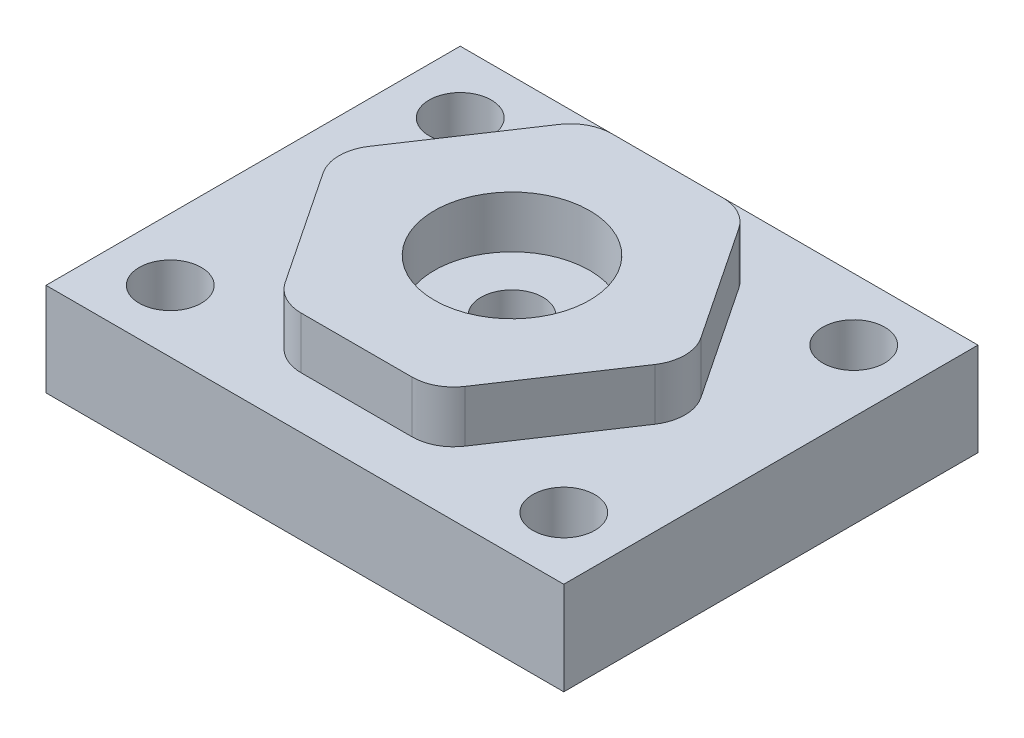
ISO-10303-21;
HEADER;
FILE_DESCRIPTION(('STEP AP214'),'2;1');
FILE_NAME('part.step','',(''),(''),'','','');
FILE_SCHEMA(('AUTOMOTIVE_DESIGN { 1 0 10303 214 1 1 1 1 }'));
ENDSEC;
DATA;
#1=APPLICATION_CONTEXT('core data for automotive mechanical design processes');
#2=APPLICATION_PROTOCOL_DEFINITION('international standard','automotive_design',2000,#1);
#3=PRODUCT_CONTEXT('',#1,'mechanical');
#4=PRODUCT('Part','Part','',(#3));
#5=PRODUCT_RELATED_PRODUCT_CATEGORY('part','',(#4));
#6=PRODUCT_DEFINITION_FORMATION('','',#4);
#7=PRODUCT_DEFINITION_CONTEXT('part definition',#1,'design');
#8=PRODUCT_DEFINITION('design','',#6,#7);
#9=PRODUCT_DEFINITION_SHAPE('','',#8);
#10=(LENGTH_UNIT() NAMED_UNIT(*) SI_UNIT(.MILLI.,.METRE.));
#11=(NAMED_UNIT(*) PLANE_ANGLE_UNIT() SI_UNIT($,.RADIAN.));
#12=(NAMED_UNIT(*) SI_UNIT($,.STERADIAN.) SOLID_ANGLE_UNIT());
#13=UNCERTAINTY_MEASURE_WITH_UNIT(LENGTH_MEASURE(1.E-05),#10,'distance_accuracy_value','');
#14=(GEOMETRIC_REPRESENTATION_CONTEXT(3) GLOBAL_UNCERTAINTY_ASSIGNED_CONTEXT((#13)) GLOBAL_UNIT_ASSIGNED_CONTEXT((#10,
#11,#12)) REPRESENTATION_CONTEXT('',''));
#15=CARTESIAN_POINT('',(0.,0.,0.));
#16=DIRECTION('',(0.,0.,1.));
#17=DIRECTION('',(1.,0.,0.));
#18=AXIS2_PLACEMENT_3D('',#15,#16,#17);
#19=CARTESIAN_POINT('',(13.5,14.,15.));
#20=DIRECTION('',(0.,0.,1.));
#21=DIRECTION('',(1.,0.,0.));
#22=AXIS2_PLACEMENT_3D('',#19,#20,#21);
#23=PLANE('',#22);
#24=DIRECTION('',(-1.,0.,0.));
#25=VECTOR('',#24,1.);
#26=CARTESIAN_POINT('',(13.5,9.,15.));
#27=LINE('',#26,#25);
#28=CARTESIAN_POINT('',(5.35926496604799,9.,15.));
#29=VERTEX_POINT('',#28);
#30=CARTESIAN_POINT('',(-5.35926496604798,9.,15.));
#31=VERTEX_POINT('',#30);
#32=EDGE_CURVE('E181',#29,#31,#27,.T.);
#33=ORIENTED_EDGE('',*,*,#32,.F.);
#34=DIRECTION('',(0.,1.,0.));
#35=VECTOR('',#34,1.);
#36=CARTESIAN_POINT('',(5.35926496604799,9.,15.));
#37=LINE('',#36,#35);
#38=CARTESIAN_POINT('',(5.35926496604799,14.,15.));
#39=VERTEX_POINT('',#38);
#40=EDGE_CURVE('E292',#29,#39,#37,.T.);
#41=ORIENTED_EDGE('',*,*,#40,.T.);
#42=DIRECTION('',(-1.,0.,0.));
#43=VECTOR('',#42,1.);
#44=CARTESIAN_POINT('',(13.5,14.,15.));
#45=LINE('',#44,#43);
#46=CARTESIAN_POINT('',(-5.35926496604798,14.,15.));
#47=VERTEX_POINT('',#46);
#48=EDGE_CURVE('E45',#39,#47,#45,.T.);
#49=ORIENTED_EDGE('',*,*,#48,.T.);
#50=DIRECTION('',(0.,1.,0.));
#51=VECTOR('',#50,1.);
#52=CARTESIAN_POINT('',(-5.35926496604798,9.,15.));
#53=LINE('',#52,#51);
#54=EDGE_CURVE('E294',#31,#47,#53,.T.);
#55=ORIENTED_EDGE('',*,*,#54,.F.);
#56=EDGE_LOOP('',(#33,#41,#49,#55));
#57=FACE_BOUND('',#56,.T.);
#58=ADVANCED_FACE('F30',(#57),#23,.T.);
#59=CARTESIAN_POINT('',(-13.5,14.,11.));
#60=DIRECTION('',(0.,-1.,0.));
#61=DIRECTION('',(0.,0.,-1.));
#62=AXIS2_PLACEMENT_3D('',#59,#60,#61);
#63=PLANE('',#62);
#64=CARTESIAN_POINT('',(0.,14.,0.));
#65=DIRECTION('',(0.,1.,0.));
#66=DIRECTION('',(0.,0.,1.));
#67=AXIS2_PLACEMENT_3D('',#64,#65,#66);
#68=CIRCLE('',#67,7.5);
#69=CARTESIAN_POINT('',(0.,14.,7.5));
#70=VERTEX_POINT('',#69);
#71=EDGE_CURVE('E186',#70,#70,#68,.T.);
#72=ORIENTED_EDGE('',*,*,#71,.F.);
#73=EDGE_LOOP('',(#72));
#74=FACE_BOUND('',#73,.T.);
#75=CARTESIAN_POINT('',(5.35926496604801,14.,11.));
#76=DIRECTION('',(0.,1.,0.));
#77=DIRECTION('',(0.,0.,1.));
#78=AXIS2_PLACEMENT_3D('',#75,#76,#77);
#79=CIRCLE('',#78,4.);
#80=CARTESIAN_POINT('',(8.6874661433994,14.,13.2188007849009));
#81=VERTEX_POINT('',#80);
#82=EDGE_CURVE('E165',#39,#81,#79,.T.);
#83=ORIENTED_EDGE('',*,*,#82,.T.);
#84=DIRECTION('',(0.554700196225229,0.,-0.832050294337844));
#85=VECTOR('',#84,1.);
#86=CARTESIAN_POINT('',(1.03937397389173,14.,24.6909390391624));
#87=LINE('',#86,#85);
#88=CARTESIAN_POINT('',(16.0207994767327,14.,2.21880078490094));
#89=VERTEX_POINT('',#88);
#90=EDGE_CURVE('E348',#81,#89,#87,.T.);
#91=ORIENTED_EDGE('',*,*,#90,.T.);
#92=CARTESIAN_POINT('',(12.6925982993814,14.,0.));
#93=DIRECTION('',(0.,1.,0.));
#94=DIRECTION('',(0.,0.,1.));
#95=AXIS2_PLACEMENT_3D('',#92,#93,#94);
#96=CIRCLE('',#95,4.);
#97=CARTESIAN_POINT('',(16.0207994767327,14.,-2.21880078490093));
#98=VERTEX_POINT('',#97);
#99=EDGE_CURVE('E351',#89,#98,#96,.T.);
#100=ORIENTED_EDGE('',*,*,#99,.T.);
#101=DIRECTION('',(0.554700196225229,0.,0.832050294337844));
#102=VECTOR('',#101,1.);
#103=CARTESIAN_POINT('',(1.03937397389173,14.,-24.6909390391624));
#104=LINE('',#103,#102);
#105=CARTESIAN_POINT('',(8.68746614339941,14.,-13.2188007849009));
#106=VERTEX_POINT('',#105);
#107=EDGE_CURVE('E354',#106,#98,#104,.T.);
#108=ORIENTED_EDGE('',*,*,#107,.F.);
#109=CARTESIAN_POINT('',(5.35926496604801,14.,-11.));
#110=DIRECTION('',(0.,1.,0.));
#111=DIRECTION('',(0.,0.,1.));
#112=AXIS2_PLACEMENT_3D('',#109,#110,#111);
#113=CIRCLE('',#112,4.);
#114=CARTESIAN_POINT('',(5.35926496604799,14.,-15.));
#115=VERTEX_POINT('',#114);
#116=EDGE_CURVE('E286',#115,#106,#113,.F.);
#117=ORIENTED_EDGE('',*,*,#116,.F.);
#118=DIRECTION('',(-1.,0.,0.));
#119=VECTOR('',#118,1.);
#120=CARTESIAN_POINT('',(13.5,14.,-15.));
#121=LINE('',#120,#119);
#122=CARTESIAN_POINT('',(-5.35926496604799,14.,-15.));
#123=VERTEX_POINT('',#122);
#124=EDGE_CURVE('E173',#115,#123,#121,.T.);
#125=ORIENTED_EDGE('',*,*,#124,.T.);
#126=CARTESIAN_POINT('',(-5.35926496604801,14.,-11.));
#127=DIRECTION('',(0.,1.,0.));
#128=DIRECTION('',(0.,0.,1.));
#129=AXIS2_PLACEMENT_3D('',#126,#127,#128);
#130=CIRCLE('',#129,4.);
#131=CARTESIAN_POINT('',(-8.68746614339939,14.,-13.2188007849009));
#132=VERTEX_POINT('',#131);
#133=EDGE_CURVE('E284',#123,#132,#130,.T.);
#134=ORIENTED_EDGE('',*,*,#133,.T.);
#135=DIRECTION('',(-0.554700196225229,0.,0.832050294337844));
#136=VECTOR('',#135,1.);
#137=CARTESIAN_POINT('',(-23.1913952568775,14.,8.53709288531626));
#138=LINE('',#137,#136);
#139=CARTESIAN_POINT('',(-16.0207994767327,14.,-2.21880078490093));
#140=VERTEX_POINT('',#139);
#141=EDGE_CURVE('E314',#132,#140,#138,.T.);
#142=ORIENTED_EDGE('',*,*,#141,.T.);
#143=CARTESIAN_POINT('',(-12.6925982993813,14.,0.));
#144=DIRECTION('',(0.,1.,0.));
#145=DIRECTION('',(0.,0.,1.));
#146=AXIS2_PLACEMENT_3D('',#143,#144,#145);
#147=CIRCLE('',#146,4.);
#148=CARTESIAN_POINT('',(-16.0207994767327,14.,2.21880078490094));
#149=VERTEX_POINT('',#148);
#150=EDGE_CURVE('E311',#149,#140,#147,.F.);
#151=ORIENTED_EDGE('',*,*,#150,.F.);
#152=DIRECTION('',(-0.554700196225229,0.,-0.832050294337844));
#153=VECTOR('',#152,1.);
#154=CARTESIAN_POINT('',(-23.1913952568775,14.,-8.53709288531625));
#155=LINE('',#154,#153);
#156=CARTESIAN_POINT('',(-8.68746614339939,14.,13.2188007849009));
#157=VERTEX_POINT('',#156);
#158=EDGE_CURVE('E308',#157,#149,#155,.T.);
#159=ORIENTED_EDGE('',*,*,#158,.F.);
#160=CARTESIAN_POINT('',(-5.359264966048,14.,11.));
#161=DIRECTION('',(0.,1.,0.));
#162=DIRECTION('',(0.,0.,1.));
#163=AXIS2_PLACEMENT_3D('',#160,#161,#162);
#164=CIRCLE('',#163,4.);
#165=EDGE_CURVE('E291',#47,#157,#164,.F.);
#166=ORIENTED_EDGE('',*,*,#165,.F.);
#167=ORIENTED_EDGE('',*,*,#48,.F.);
#168=EDGE_LOOP('',(#83,#91,#100,#108,#117,#125,#134,#142,#151,#159,#166,#167));
#169=FACE_BOUND('',#168,.T.);
#170=ADVANCED_FACE('F233',(#74,#169),#63,.F.);
#171=CARTESIAN_POINT('',(-25.,9.,20.));
#172=DIRECTION('',(1.,0.,0.));
#173=DIRECTION('',(0.,0.,-1.));
#174=AXIS2_PLACEMENT_3D('',#171,#172,#173);
#175=PLANE('',#174);
#176=DIRECTION('',(0.,0.,1.));
#177=VECTOR('',#176,1.);
#178=CARTESIAN_POINT('',(-25.,0.,20.));
#179=LINE('',#178,#177);
#180=CARTESIAN_POINT('',(-25.,0.,-20.));
#181=VERTEX_POINT('',#180);
#182=CARTESIAN_POINT('',(-25.,0.,20.));
#183=VERTEX_POINT('',#182);
#184=EDGE_CURVE('E198',#181,#183,#179,.T.);
#185=ORIENTED_EDGE('',*,*,#184,.T.);
#186=DIRECTION('',(0.,-1.,0.));
#187=VECTOR('',#186,1.);
#188=CARTESIAN_POINT('',(-25.,9.,20.));
#189=LINE('',#188,#187);
#190=CARTESIAN_POINT('',(-25.,9.,20.));
#191=VERTEX_POINT('',#190);
#192=EDGE_CURVE('E11',#191,#183,#189,.T.);
#193=ORIENTED_EDGE('',*,*,#192,.F.);
#194=DIRECTION('',(0.,0.,1.));
#195=VECTOR('',#194,1.);
#196=CARTESIAN_POINT('',(-25.,9.,20.));
#197=LINE('',#196,#195);
#198=CARTESIAN_POINT('',(-25.,9.,-20.));
#199=VERTEX_POINT('',#198);
#200=EDGE_CURVE('E191',#199,#191,#197,.T.);
#201=ORIENTED_EDGE('',*,*,#200,.F.);
#202=DIRECTION('',(0.,-1.,0.));
#203=VECTOR('',#202,1.);
#204=CARTESIAN_POINT('',(-25.,9.,-20.));
#205=LINE('',#204,#203);
#206=EDGE_CURVE('E197',#199,#181,#205,.T.);
#207=ORIENTED_EDGE('',*,*,#206,.T.);
#208=EDGE_LOOP('',(#185,#193,#201,#207));
#209=FACE_BOUND('',#208,.T.);
#210=ADVANCED_FACE('F32',(#209),#175,.F.);
#211=CARTESIAN_POINT('',(25.,9.,20.));
#212=DIRECTION('',(0.,0.,-1.));
#213=DIRECTION('',(-1.,0.,0.));
#214=AXIS2_PLACEMENT_3D('',#211,#212,#213);
#215=PLANE('',#214);
#216=DIRECTION('',(1.,0.,0.));
#217=VECTOR('',#216,1.);
#218=CARTESIAN_POINT('',(25.,0.,20.));
#219=LINE('',#218,#217);
#220=CARTESIAN_POINT('',(25.,0.,20.));
#221=VERTEX_POINT('',#220);
#222=EDGE_CURVE('E201',#183,#221,#219,.T.);
#223=ORIENTED_EDGE('',*,*,#222,.T.);
#224=DIRECTION('',(0.,-1.,0.));
#225=VECTOR('',#224,1.);
#226=CARTESIAN_POINT('',(25.,9.,20.));
#227=LINE('',#226,#225);
#228=CARTESIAN_POINT('',(25.,9.,20.));
#229=VERTEX_POINT('',#228);
#230=EDGE_CURVE('E38',#229,#221,#227,.T.);
#231=ORIENTED_EDGE('',*,*,#230,.F.);
#232=DIRECTION('',(1.,0.,0.));
#233=VECTOR('',#232,1.);
#234=CARTESIAN_POINT('',(25.,9.,20.));
#235=LINE('',#234,#233);
#236=EDGE_CURVE('E82',#191,#229,#235,.T.);
#237=ORIENTED_EDGE('',*,*,#236,.F.);
#238=ORIENTED_EDGE('',*,*,#192,.T.);
#239=EDGE_LOOP('',(#223,#231,#237,#238));
#240=FACE_BOUND('',#239,.T.);
#241=ADVANCED_FACE('F229',(#240),#215,.F.);
#242=CARTESIAN_POINT('',(25.,9.,20.));
#243=DIRECTION('',(-1.,0.,0.));
#244=DIRECTION('',(0.,0.,1.));
#245=AXIS2_PLACEMENT_3D('',#242,#243,#244);
#246=PLANE('',#245);
#247=DIRECTION('',(0.,0.,-1.));
#248=VECTOR('',#247,1.);
#249=CARTESIAN_POINT('',(25.,0.,20.));
#250=LINE('',#249,#248);
#251=CARTESIAN_POINT('',(25.,0.,-20.));
#252=VERTEX_POINT('',#251);
#253=EDGE_CURVE('E203',#221,#252,#250,.T.);
#254=ORIENTED_EDGE('',*,*,#253,.T.);
#255=DIRECTION('',(0.,-1.,0.));
#256=VECTOR('',#255,1.);
#257=CARTESIAN_POINT('',(25.,9.,-20.));
#258=LINE('',#257,#256);
#259=CARTESIAN_POINT('',(25.,9.,-20.));
#260=VERTEX_POINT('',#259);
#261=EDGE_CURVE('E207',#260,#252,#258,.T.);
#262=ORIENTED_EDGE('',*,*,#261,.F.);
#263=DIRECTION('',(0.,0.,-1.));
#264=VECTOR('',#263,1.);
#265=CARTESIAN_POINT('',(25.,9.,20.));
#266=LINE('',#265,#264);
#267=EDGE_CURVE('E194',#229,#260,#266,.T.);
#268=ORIENTED_EDGE('',*,*,#267,.F.);
#269=ORIENTED_EDGE('',*,*,#230,.T.);
#270=EDGE_LOOP('',(#254,#262,#268,#269));
#271=FACE_BOUND('',#270,.T.);
#272=ADVANCED_FACE('F212',(#271),#246,.F.);
#273=CARTESIAN_POINT('',(25.,9.,-20.));
#274=DIRECTION('',(0.,0.,1.));
#275=DIRECTION('',(1.,0.,0.));
#276=AXIS2_PLACEMENT_3D('',#273,#274,#275);
#277=PLANE('',#276);
#278=DIRECTION('',(-1.,0.,0.));
#279=VECTOR('',#278,1.);
#280=CARTESIAN_POINT('',(25.,0.,-20.));
#281=LINE('',#280,#279);
#282=EDGE_CURVE('E75',#252,#181,#281,.T.);
#283=ORIENTED_EDGE('',*,*,#282,.T.);
#284=ORIENTED_EDGE('',*,*,#206,.F.);
#285=DIRECTION('',(-1.,0.,0.));
#286=VECTOR('',#285,1.);
#287=CARTESIAN_POINT('',(25.,9.,-20.));
#288=LINE('',#287,#286);
#289=EDGE_CURVE('E54',#260,#199,#288,.T.);
#290=ORIENTED_EDGE('',*,*,#289,.F.);
#291=ORIENTED_EDGE('',*,*,#261,.T.);
#292=EDGE_LOOP('',(#283,#284,#290,#291));
#293=FACE_BOUND('',#292,.T.);
#294=ADVANCED_FACE('F220',(#293),#277,.F.);
#295=CARTESIAN_POINT('',(-25.,9.,-20.));
#296=DIRECTION('',(0.,1.,0.));
#297=DIRECTION('',(0.,0.,1.));
#298=AXIS2_PLACEMENT_3D('',#295,#296,#297);
#299=PLANE('',#298);
#300=CARTESIAN_POINT('',(19.,9.,-14.));
#301=DIRECTION('',(0.,1.,0.));
#302=DIRECTION('',(0.,0.,-1.));
#303=AXIS2_PLACEMENT_3D('',#300,#301,#302);
#304=CIRCLE('',#303,3.);
#305=CARTESIAN_POINT('',(19.,9.,-17.));
#306=VERTEX_POINT('',#305);
#307=EDGE_CURVE('E376',#306,#306,#304,.T.);
#308=ORIENTED_EDGE('',*,*,#307,.F.);
#309=EDGE_LOOP('',(#308));
#310=FACE_BOUND('',#309,.T.);
#311=CARTESIAN_POINT('',(19.,9.,14.));
#312=DIRECTION('',(0.,1.,0.));
#313=DIRECTION('',(0.,0.,1.));
#314=AXIS2_PLACEMENT_3D('',#311,#312,#313);
#315=CIRCLE('',#314,3.);
#316=CARTESIAN_POINT('',(19.,9.,17.));
#317=VERTEX_POINT('',#316);
#318=EDGE_CURVE('E372',#317,#317,#315,.T.);
#319=ORIENTED_EDGE('',*,*,#318,.F.);
#320=EDGE_LOOP('',(#319));
#321=FACE_BOUND('',#320,.T.);
#322=CARTESIAN_POINT('',(-19.,9.,14.));
#323=DIRECTION('',(0.,1.,0.));
#324=DIRECTION('',(0.,0.,-1.));
#325=AXIS2_PLACEMENT_3D('',#322,#323,#324);
#326=CIRCLE('',#325,3.);
#327=CARTESIAN_POINT('',(-19.,9.,11.));
#328=VERTEX_POINT('',#327);
#329=EDGE_CURVE('E368',#328,#328,#326,.T.);
#330=ORIENTED_EDGE('',*,*,#329,.F.);
#331=EDGE_LOOP('',(#330));
#332=FACE_BOUND('',#331,.T.);
#333=CARTESIAN_POINT('',(-19.,9.,-14.));
#334=DIRECTION('',(0.,1.,0.));
#335=DIRECTION('',(0.,0.,1.));
#336=AXIS2_PLACEMENT_3D('',#333,#334,#335);
#337=CIRCLE('',#336,3.);
#338=CARTESIAN_POINT('',(-19.,9.,-11.));
#339=VERTEX_POINT('',#338);
#340=EDGE_CURVE('E364',#339,#339,#337,.T.);
#341=ORIENTED_EDGE('',*,*,#340,.F.);
#342=EDGE_LOOP('',(#341));
#343=FACE_BOUND('',#342,.T.);
#344=CARTESIAN_POINT('',(5.35926496604801,9.,11.));
#345=DIRECTION('',(0.,1.,0.));
#346=DIRECTION('',(0.,0.,1.));
#347=AXIS2_PLACEMENT_3D('',#344,#345,#346);
#348=CIRCLE('',#347,4.);
#349=CARTESIAN_POINT('',(8.6874661433994,9.,13.2188007849009));
#350=VERTEX_POINT('',#349);
#351=EDGE_CURVE('E174',#29,#350,#348,.T.);
#352=ORIENTED_EDGE('',*,*,#351,.F.);
#353=ORIENTED_EDGE('',*,*,#32,.T.);
#354=CARTESIAN_POINT('',(-5.359264966048,9.,11.));
#355=DIRECTION('',(0.,1.,0.));
#356=DIRECTION('',(0.,0.,1.));
#357=AXIS2_PLACEMENT_3D('',#354,#355,#356);
#358=CIRCLE('',#357,4.);
#359=CARTESIAN_POINT('',(-8.68746614339939,9.,13.2188007849009));
#360=VERTEX_POINT('',#359);
#361=EDGE_CURVE('E335',#31,#360,#358,.F.);
#362=ORIENTED_EDGE('',*,*,#361,.T.);
#363=DIRECTION('',(-0.554700196225229,0.,-0.832050294337844));
#364=VECTOR('',#363,1.);
#365=CARTESIAN_POINT('',(-23.1913952568775,9.,-8.53709288531625));
#366=LINE('',#365,#364);
#367=CARTESIAN_POINT('',(-16.0207994767327,9.,2.21880078490094));
#368=VERTEX_POINT('',#367);
#369=EDGE_CURVE('E302',#360,#368,#366,.T.);
#370=ORIENTED_EDGE('',*,*,#369,.T.);
#371=CARTESIAN_POINT('',(-12.6925982993813,9.,0.));
#372=DIRECTION('',(0.,1.,0.));
#373=DIRECTION('',(0.,0.,1.));
#374=AXIS2_PLACEMENT_3D('',#371,#372,#373);
#375=CIRCLE('',#374,4.);
#376=CARTESIAN_POINT('',(-16.0207994767327,9.,-2.21880078490093));
#377=VERTEX_POINT('',#376);
#378=EDGE_CURVE('E297',#368,#377,#375,.F.);
#379=ORIENTED_EDGE('',*,*,#378,.T.);
#380=DIRECTION('',(-0.554700196225229,0.,0.832050294337844));
#381=VECTOR('',#380,1.);
#382=CARTESIAN_POINT('',(-23.1913952568775,9.,8.53709288531626));
#383=LINE('',#382,#381);
#384=CARTESIAN_POINT('',(-8.68746614339939,9.,-13.2188007849009));
#385=VERTEX_POINT('',#384);
#386=EDGE_CURVE('E295',#385,#377,#383,.T.);
#387=ORIENTED_EDGE('',*,*,#386,.F.);
#388=CARTESIAN_POINT('',(-5.35926496604801,9.,-11.));
#389=DIRECTION('',(0.,1.,0.));
#390=DIRECTION('',(0.,0.,1.));
#391=AXIS2_PLACEMENT_3D('',#388,#389,#390);
#392=CIRCLE('',#391,4.);
#393=CARTESIAN_POINT('',(-5.35926496604799,9.,-15.));
#394=VERTEX_POINT('',#393);
#395=EDGE_CURVE('E180',#394,#385,#392,.T.);
#396=ORIENTED_EDGE('',*,*,#395,.F.);
#397=DIRECTION('',(-1.,0.,0.));
#398=VECTOR('',#397,1.);
#399=CARTESIAN_POINT('',(13.5,9.,-15.));
#400=LINE('',#399,#398);
#401=CARTESIAN_POINT('',(5.35926496604799,9.,-15.));
#402=VERTEX_POINT('',#401);
#403=EDGE_CURVE('E171',#402,#394,#400,.T.);
#404=ORIENTED_EDGE('',*,*,#403,.F.);
#405=CARTESIAN_POINT('',(5.35926496604801,9.,-11.));
#406=DIRECTION('',(0.,1.,0.));
#407=DIRECTION('',(0.,0.,1.));
#408=AXIS2_PLACEMENT_3D('',#405,#406,#407);
#409=CIRCLE('',#408,4.);
#410=CARTESIAN_POINT('',(8.68746614339941,9.,-13.2188007849009));
#411=VERTEX_POINT('',#410);
#412=EDGE_CURVE('E153',#402,#411,#409,.F.);
#413=ORIENTED_EDGE('',*,*,#412,.T.);
#414=DIRECTION('',(0.554700196225229,0.,0.832050294337844));
#415=VECTOR('',#414,1.);
#416=CARTESIAN_POINT('',(1.03937397389173,9.,-24.6909390391624));
#417=LINE('',#416,#415);
#418=CARTESIAN_POINT('',(16.0207994767327,9.,-2.21880078490093));
#419=VERTEX_POINT('',#418);
#420=EDGE_CURVE('E164',#411,#419,#417,.T.);
#421=ORIENTED_EDGE('',*,*,#420,.T.);
#422=CARTESIAN_POINT('',(12.6925982993814,9.,0.));
#423=DIRECTION('',(0.,1.,0.));
#424=DIRECTION('',(0.,0.,1.));
#425=AXIS2_PLACEMENT_3D('',#422,#423,#424);
#426=CIRCLE('',#425,4.);
#427=CARTESIAN_POINT('',(16.0207994767327,9.,2.21880078490094));
#428=VERTEX_POINT('',#427);
#429=EDGE_CURVE('E361',#428,#419,#426,.T.);
#430=ORIENTED_EDGE('',*,*,#429,.F.);
#431=DIRECTION('',(0.554700196225229,0.,-0.832050294337844));
#432=VECTOR('',#431,1.);
#433=CARTESIAN_POINT('',(1.03937397389173,9.,24.6909390391624));
#434=LINE('',#433,#432);
#435=EDGE_CURVE('E359',#350,#428,#434,.T.);
#436=ORIENTED_EDGE('',*,*,#435,.F.);
#437=EDGE_LOOP('',(#352,#353,#362,#370,#379,#387,#396,#404,#413,#421,#430,#436));
#438=FACE_BOUND('',#437,.T.);
#439=ORIENTED_EDGE('',*,*,#200,.T.);
#440=ORIENTED_EDGE('',*,*,#236,.T.);
#441=ORIENTED_EDGE('',*,*,#267,.T.);
#442=ORIENTED_EDGE('',*,*,#289,.T.);
#443=EDGE_LOOP('',(#439,#440,#441,#442));
#444=FACE_BOUND('',#443,.T.);
#445=ADVANCED_FACE('F178',(#310,#321,#332,#343,#438,#444),#299,.T.);
#446=CARTESIAN_POINT('',(-25.,0.,-20.));
#447=DIRECTION('',(0.,1.,0.));
#448=DIRECTION('',(0.,0.,1.));
#449=AXIS2_PLACEMENT_3D('',#446,#447,#448);
#450=PLANE('',#449);
#451=CARTESIAN_POINT('',(19.,0.,-14.));
#452=DIRECTION('',(0.,1.,0.));
#453=DIRECTION('',(0.,0.,-1.));
#454=AXIS2_PLACEMENT_3D('',#451,#452,#453);
#455=CIRCLE('',#454,3.);
#456=CARTESIAN_POINT('',(19.,0.,-17.));
#457=VERTEX_POINT('',#456);
#458=EDGE_CURVE('E252',#457,#457,#455,.T.);
#459=ORIENTED_EDGE('',*,*,#458,.T.);
#460=EDGE_LOOP('',(#459));
#461=FACE_BOUND('',#460,.T.);
#462=CARTESIAN_POINT('',(19.,0.,14.));
#463=DIRECTION('',(0.,1.,0.));
#464=DIRECTION('',(0.,0.,1.));
#465=AXIS2_PLACEMENT_3D('',#462,#463,#464);
#466=CIRCLE('',#465,3.);
#467=CARTESIAN_POINT('',(19.,0.,17.));
#468=VERTEX_POINT('',#467);
#469=EDGE_CURVE('E256',#468,#468,#466,.T.);
#470=ORIENTED_EDGE('',*,*,#469,.T.);
#471=EDGE_LOOP('',(#470));
#472=FACE_BOUND('',#471,.T.);
#473=CARTESIAN_POINT('',(-19.,0.,14.));
#474=DIRECTION('',(0.,1.,0.));
#475=DIRECTION('',(0.,0.,-1.));
#476=AXIS2_PLACEMENT_3D('',#473,#474,#475);
#477=CIRCLE('',#476,3.);
#478=CARTESIAN_POINT('',(-19.,0.,11.));
#479=VERTEX_POINT('',#478);
#480=EDGE_CURVE('E260',#479,#479,#477,.T.);
#481=ORIENTED_EDGE('',*,*,#480,.T.);
#482=EDGE_LOOP('',(#481));
#483=FACE_BOUND('',#482,.T.);
#484=CARTESIAN_POINT('',(-19.,0.,-14.));
#485=DIRECTION('',(0.,1.,0.));
#486=DIRECTION('',(0.,0.,1.));
#487=AXIS2_PLACEMENT_3D('',#484,#485,#486);
#488=CIRCLE('',#487,3.);
#489=CARTESIAN_POINT('',(-19.,0.,-11.));
#490=VERTEX_POINT('',#489);
#491=EDGE_CURVE('E264',#490,#490,#488,.T.);
#492=ORIENTED_EDGE('',*,*,#491,.T.);
#493=EDGE_LOOP('',(#492));
#494=FACE_BOUND('',#493,.T.);
#495=CARTESIAN_POINT('',(0.,0.,0.));
#496=DIRECTION('',(0.,1.,0.));
#497=DIRECTION('',(0.,0.,1.));
#498=AXIS2_PLACEMENT_3D('',#495,#496,#497);
#499=CIRCLE('',#498,3.);
#500=CARTESIAN_POINT('',(0.,0.,3.));
#501=VERTEX_POINT('',#500);
#502=EDGE_CURVE('E267',#501,#501,#499,.T.);
#503=ORIENTED_EDGE('',*,*,#502,.T.);
#504=EDGE_LOOP('',(#503));
#505=FACE_BOUND('',#504,.T.);
#506=ORIENTED_EDGE('',*,*,#184,.F.);
#507=ORIENTED_EDGE('',*,*,#282,.F.);
#508=ORIENTED_EDGE('',*,*,#253,.F.);
#509=ORIENTED_EDGE('',*,*,#222,.F.);
#510=EDGE_LOOP('',(#506,#507,#508,#509));
#511=FACE_BOUND('',#510,.T.);
#512=ADVANCED_FACE('F216',(#461,#472,#483,#494,#505,#511),#450,.F.);
#513=CARTESIAN_POINT('',(13.5,14.,-15.));
#514=DIRECTION('',(0.,0.,1.));
#515=DIRECTION('',(1.,0.,0.));
#516=AXIS2_PLACEMENT_3D('',#513,#514,#515);
#517=PLANE('',#516);
#518=ORIENTED_EDGE('',*,*,#124,.F.);
#519=DIRECTION('',(0.,1.,0.));
#520=VECTOR('',#519,1.);
#521=CARTESIAN_POINT('',(5.35926496604799,9.,-15.));
#522=LINE('',#521,#520);
#523=EDGE_CURVE('E157',#402,#115,#522,.T.);
#524=ORIENTED_EDGE('',*,*,#523,.F.);
#525=ORIENTED_EDGE('',*,*,#403,.T.);
#526=DIRECTION('',(0.,1.,0.));
#527=VECTOR('',#526,1.);
#528=CARTESIAN_POINT('',(-5.35926496604799,9.,-15.));
#529=LINE('',#528,#527);
#530=EDGE_CURVE('E277',#394,#123,#529,.T.);
#531=ORIENTED_EDGE('',*,*,#530,.T.);
#532=EDGE_LOOP('',(#518,#524,#525,#531));
#533=FACE_BOUND('',#532,.T.);
#534=ADVANCED_FACE('F169',(#533),#517,.F.);
#535=CARTESIAN_POINT('',(0.,9.,0.));
#536=DIRECTION('',(0.,1.,0.));
#537=DIRECTION('',(0.,0.,1.));
#538=AXIS2_PLACEMENT_3D('',#535,#536,#537);
#539=CYLINDRICAL_SURFACE('',#538,7.5);
#540=CARTESIAN_POINT('',(0.,9.,0.));
#541=DIRECTION('',(0.,1.,0.));
#542=DIRECTION('',(0.,0.,1.));
#543=AXIS2_PLACEMENT_3D('',#540,#541,#542);
#544=CIRCLE('',#543,7.5);
#545=CARTESIAN_POINT('',(0.,9.,7.5));
#546=VERTEX_POINT('',#545);
#547=EDGE_CURVE('E182',#546,#546,#544,.T.);
#548=ORIENTED_EDGE('',*,*,#547,.F.);
#549=EDGE_LOOP('',(#548));
#550=FACE_BOUND('',#549,.T.);
#551=ORIENTED_EDGE('',*,*,#71,.T.);
#552=EDGE_LOOP('',(#551));
#553=FACE_BOUND('',#552,.T.);
#554=ADVANCED_FACE('F244',(#550,#553),#539,.F.);
#555=CARTESIAN_POINT('',(0.,9.,0.));
#556=DIRECTION('',(0.,1.,0.));
#557=DIRECTION('',(0.,0.,1.));
#558=AXIS2_PLACEMENT_3D('',#555,#556,#557);
#559=PLANE('',#558);
#560=CARTESIAN_POINT('',(0.,9.,0.));
#561=DIRECTION('',(0.,1.,0.));
#562=DIRECTION('',(0.,0.,1.));
#563=AXIS2_PLACEMENT_3D('',#560,#561,#562);
#564=CIRCLE('',#563,3.);
#565=CARTESIAN_POINT('',(0.,9.,3.));
#566=VERTEX_POINT('',#565);
#567=EDGE_CURVE('E269',#566,#566,#564,.T.);
#568=ORIENTED_EDGE('',*,*,#567,.F.);
#569=EDGE_LOOP('',(#568));
#570=FACE_BOUND('',#569,.T.);
#571=ORIENTED_EDGE('',*,*,#547,.T.);
#572=EDGE_LOOP('',(#571));
#573=FACE_BOUND('',#572,.T.);
#574=ADVANCED_FACE('F434',(#570,#573),#559,.T.);
#575=CARTESIAN_POINT('',(0.,0.,0.));
#576=DIRECTION('',(0.,1.,0.));
#577=DIRECTION('',(0.,0.,1.));
#578=AXIS2_PLACEMENT_3D('',#575,#576,#577);
#579=CYLINDRICAL_SURFACE('',#578,3.);
#580=ORIENTED_EDGE('',*,*,#502,.F.);
#581=EDGE_LOOP('',(#580));
#582=FACE_BOUND('',#581,.T.);
#583=ORIENTED_EDGE('',*,*,#567,.T.);
#584=EDGE_LOOP('',(#583));
#585=FACE_BOUND('',#584,.T.);
#586=ADVANCED_FACE('F431',(#582,#585),#579,.F.);
#587=CARTESIAN_POINT('',(-5.35926496604801,9.,-11.));
#588=DIRECTION('',(0.,1.,0.));
#589=DIRECTION('',(0.,0.,1.));
#590=AXIS2_PLACEMENT_3D('',#587,#588,#589);
#591=CYLINDRICAL_SURFACE('',#590,4.);
#592=ORIENTED_EDGE('',*,*,#133,.F.);
#593=ORIENTED_EDGE('',*,*,#530,.F.);
#594=ORIENTED_EDGE('',*,*,#395,.T.);
#595=DIRECTION('',(0.,1.,0.));
#596=VECTOR('',#595,1.);
#597=CARTESIAN_POINT('',(-8.68746614339939,9.,-13.2188007849009));
#598=LINE('',#597,#596);
#599=EDGE_CURVE('E274',#385,#132,#598,.T.);
#600=ORIENTED_EDGE('',*,*,#599,.T.);
#601=EDGE_LOOP('',(#592,#593,#594,#600));
#602=FACE_BOUND('',#601,.T.);
#603=ADVANCED_FACE('F289',(#602),#591,.T.);
#604=CARTESIAN_POINT('',(-23.1913952568775,9.,8.53709288531626));
#605=DIRECTION('',(-0.832050294337844,0.,-0.554700196225229));
#606=DIRECTION('',(-0.554700196225229,0.,0.832050294337844));
#607=AXIS2_PLACEMENT_3D('',#604,#605,#606);
#608=PLANE('',#607);
#609=ORIENTED_EDGE('',*,*,#141,.F.);
#610=ORIENTED_EDGE('',*,*,#599,.F.);
#611=ORIENTED_EDGE('',*,*,#386,.T.);
#612=DIRECTION('',(0.,1.,0.));
#613=VECTOR('',#612,1.);
#614=CARTESIAN_POINT('',(-16.0207994767327,9.,-2.21880078490093));
#615=LINE('',#614,#613);
#616=EDGE_CURVE('E317',#377,#140,#615,.T.);
#617=ORIENTED_EDGE('',*,*,#616,.T.);
#618=EDGE_LOOP('',(#609,#610,#611,#617));
#619=FACE_BOUND('',#618,.T.);
#620=ADVANCED_FACE('F420',(#619),#608,.T.);
#621=CARTESIAN_POINT('',(-12.6925982993813,9.,0.));
#622=DIRECTION('',(0.,1.,0.));
#623=DIRECTION('',(0.,0.,1.));
#624=AXIS2_PLACEMENT_3D('',#621,#622,#623);
#625=CYLINDRICAL_SURFACE('',#624,4.);
#626=ORIENTED_EDGE('',*,*,#150,.T.);
#627=ORIENTED_EDGE('',*,*,#616,.F.);
#628=ORIENTED_EDGE('',*,*,#378,.F.);
#629=DIRECTION('',(0.,1.,0.));
#630=VECTOR('',#629,1.);
#631=CARTESIAN_POINT('',(-16.0207994767327,9.,2.21880078490094));
#632=LINE('',#631,#630);
#633=EDGE_CURVE('E319',#368,#149,#632,.T.);
#634=ORIENTED_EDGE('',*,*,#633,.T.);
#635=EDGE_LOOP('',(#626,#627,#628,#634));
#636=FACE_BOUND('',#635,.T.);
#637=ADVANCED_FACE('F333',(#636),#625,.T.);
#638=CARTESIAN_POINT('',(-23.1913952568775,9.,-8.53709288531625));
#639=DIRECTION('',(0.832050294337844,0.,-0.554700196225229));
#640=DIRECTION('',(-0.554700196225229,0.,-0.832050294337844));
#641=AXIS2_PLACEMENT_3D('',#638,#639,#640);
#642=PLANE('',#641);
#643=ORIENTED_EDGE('',*,*,#158,.T.);
#644=ORIENTED_EDGE('',*,*,#633,.F.);
#645=ORIENTED_EDGE('',*,*,#369,.F.);
#646=DIRECTION('',(0.,1.,0.));
#647=VECTOR('',#646,1.);
#648=CARTESIAN_POINT('',(-8.68746614339939,9.,13.2188007849009));
#649=LINE('',#648,#647);
#650=EDGE_CURVE('E296',#360,#157,#649,.T.);
#651=ORIENTED_EDGE('',*,*,#650,.T.);
#652=EDGE_LOOP('',(#643,#644,#645,#651));
#653=FACE_BOUND('',#652,.T.);
#654=ADVANCED_FACE('F323',(#653),#642,.F.);
#655=CARTESIAN_POINT('',(-5.359264966048,9.,11.));
#656=DIRECTION('',(0.,1.,0.));
#657=DIRECTION('',(0.,0.,1.));
#658=AXIS2_PLACEMENT_3D('',#655,#656,#657);
#659=CYLINDRICAL_SURFACE('',#658,4.);
#660=ORIENTED_EDGE('',*,*,#165,.T.);
#661=ORIENTED_EDGE('',*,*,#650,.F.);
#662=ORIENTED_EDGE('',*,*,#361,.F.);
#663=ORIENTED_EDGE('',*,*,#54,.T.);
#664=EDGE_LOOP('',(#660,#661,#662,#663));
#665=FACE_BOUND('',#664,.T.);
#666=ADVANCED_FACE('F331',(#665),#659,.T.);
#667=CARTESIAN_POINT('',(5.35926496604801,9.,11.));
#668=DIRECTION('',(0.,1.,0.));
#669=DIRECTION('',(0.,0.,1.));
#670=AXIS2_PLACEMENT_3D('',#667,#668,#669);
#671=CYLINDRICAL_SURFACE('',#670,4.);
#672=ORIENTED_EDGE('',*,*,#82,.F.);
#673=ORIENTED_EDGE('',*,*,#40,.F.);
#674=ORIENTED_EDGE('',*,*,#351,.T.);
#675=DIRECTION('',(0.,1.,0.));
#676=VECTOR('',#675,1.);
#677=CARTESIAN_POINT('',(8.6874661433994,9.,13.2188007849009));
#678=LINE('',#677,#676);
#679=EDGE_CURVE('E344',#350,#81,#678,.T.);
#680=ORIENTED_EDGE('',*,*,#679,.T.);
#681=EDGE_LOOP('',(#672,#673,#674,#680));
#682=FACE_BOUND('',#681,.T.);
#683=ADVANCED_FACE('F405',(#682),#671,.T.);
#684=CARTESIAN_POINT('',(1.03937397389173,9.,24.6909390391624));
#685=DIRECTION('',(0.832050294337844,0.,0.554700196225229));
#686=DIRECTION('',(0.554700196225229,0.,-0.832050294337844));
#687=AXIS2_PLACEMENT_3D('',#684,#685,#686);
#688=PLANE('',#687);
#689=ORIENTED_EDGE('',*,*,#90,.F.);
#690=ORIENTED_EDGE('',*,*,#679,.F.);
#691=ORIENTED_EDGE('',*,*,#435,.T.);
#692=DIRECTION('',(0.,1.,0.));
#693=VECTOR('',#692,1.);
#694=CARTESIAN_POINT('',(16.0207994767327,9.,2.21880078490094));
#695=LINE('',#694,#693);
#696=EDGE_CURVE('E342',#428,#89,#695,.T.);
#697=ORIENTED_EDGE('',*,*,#696,.T.);
#698=EDGE_LOOP('',(#689,#690,#691,#697));
#699=FACE_BOUND('',#698,.T.);
#700=ADVANCED_FACE('F408',(#699),#688,.T.);
#701=CARTESIAN_POINT('',(12.6925982993814,9.,0.));
#702=DIRECTION('',(0.,1.,0.));
#703=DIRECTION('',(0.,0.,1.));
#704=AXIS2_PLACEMENT_3D('',#701,#702,#703);
#705=CYLINDRICAL_SURFACE('',#704,4.);
#706=ORIENTED_EDGE('',*,*,#99,.F.);
#707=ORIENTED_EDGE('',*,*,#696,.F.);
#708=ORIENTED_EDGE('',*,*,#429,.T.);
#709=DIRECTION('',(0.,1.,0.));
#710=VECTOR('',#709,1.);
#711=CARTESIAN_POINT('',(16.0207994767327,9.,-2.21880078490093));
#712=LINE('',#711,#710);
#713=EDGE_CURVE('E340',#419,#98,#712,.T.);
#714=ORIENTED_EDGE('',*,*,#713,.T.);
#715=EDGE_LOOP('',(#706,#707,#708,#714));
#716=FACE_BOUND('',#715,.T.);
#717=ADVANCED_FACE('F412',(#716),#705,.T.);
#718=CARTESIAN_POINT('',(1.03937397389173,9.,-24.6909390391624));
#719=DIRECTION('',(-0.832050294337843,0.,0.554700196225229));
#720=DIRECTION('',(0.554700196225229,0.,0.832050294337843));
#721=AXIS2_PLACEMENT_3D('',#718,#719,#720);
#722=PLANE('',#721);
#723=ORIENTED_EDGE('',*,*,#107,.T.);
#724=ORIENTED_EDGE('',*,*,#713,.F.);
#725=ORIENTED_EDGE('',*,*,#420,.F.);
#726=DIRECTION('',(0.,1.,0.));
#727=VECTOR('',#726,1.);
#728=CARTESIAN_POINT('',(8.68746614339941,9.,-13.2188007849009));
#729=LINE('',#728,#727);
#730=EDGE_CURVE('E159',#411,#106,#729,.T.);
#731=ORIENTED_EDGE('',*,*,#730,.T.);
#732=EDGE_LOOP('',(#723,#724,#725,#731));
#733=FACE_BOUND('',#732,.T.);
#734=ADVANCED_FACE('F401',(#733),#722,.F.);
#735=CARTESIAN_POINT('',(5.35926496604801,9.,-11.));
#736=DIRECTION('',(0.,1.,0.));
#737=DIRECTION('',(0.,0.,1.));
#738=AXIS2_PLACEMENT_3D('',#735,#736,#737);
#739=CYLINDRICAL_SURFACE('',#738,4.);
#740=ORIENTED_EDGE('',*,*,#116,.T.);
#741=ORIENTED_EDGE('',*,*,#730,.F.);
#742=ORIENTED_EDGE('',*,*,#412,.F.);
#743=ORIENTED_EDGE('',*,*,#523,.T.);
#744=EDGE_LOOP('',(#740,#741,#742,#743));
#745=FACE_BOUND('',#744,.T.);
#746=ADVANCED_FACE('F156',(#745),#739,.T.);
#747=CARTESIAN_POINT('',(-19.,0.,-14.));
#748=DIRECTION('',(0.,1.,0.));
#749=DIRECTION('',(0.,0.,1.));
#750=AXIS2_PLACEMENT_3D('',#747,#748,#749);
#751=CYLINDRICAL_SURFACE('',#750,3.);
#752=ORIENTED_EDGE('',*,*,#491,.F.);
#753=EDGE_LOOP('',(#752));
#754=FACE_BOUND('',#753,.T.);
#755=ORIENTED_EDGE('',*,*,#340,.T.);
#756=EDGE_LOOP('',(#755));
#757=FACE_BOUND('',#756,.T.);
#758=ADVANCED_FACE('F389',(#754,#757),#751,.F.);
#759=CARTESIAN_POINT('',(-19.,0.,14.));
#760=DIRECTION('',(0.,1.,0.));
#761=DIRECTION('',(0.,0.,1.));
#762=AXIS2_PLACEMENT_3D('',#759,#760,#761);
#763=CYLINDRICAL_SURFACE('',#762,3.);
#764=ORIENTED_EDGE('',*,*,#480,.F.);
#765=EDGE_LOOP('',(#764));
#766=FACE_BOUND('',#765,.T.);
#767=ORIENTED_EDGE('',*,*,#329,.T.);
#768=EDGE_LOOP('',(#767));
#769=FACE_BOUND('',#768,.T.);
#770=ADVANCED_FACE('F391',(#766,#769),#763,.F.);
#771=CARTESIAN_POINT('',(19.,0.,14.));
#772=DIRECTION('',(0.,1.,0.));
#773=DIRECTION('',(0.,0.,1.));
#774=AXIS2_PLACEMENT_3D('',#771,#772,#773);
#775=CYLINDRICAL_SURFACE('',#774,3.);
#776=ORIENTED_EDGE('',*,*,#469,.F.);
#777=EDGE_LOOP('',(#776));
#778=FACE_BOUND('',#777,.T.);
#779=ORIENTED_EDGE('',*,*,#318,.T.);
#780=EDGE_LOOP('',(#779));
#781=FACE_BOUND('',#780,.T.);
#782=ADVANCED_FACE('F398',(#778,#781),#775,.F.);
#783=CARTESIAN_POINT('',(19.,0.,-14.));
#784=DIRECTION('',(0.,1.,0.));
#785=DIRECTION('',(0.,0.,1.));
#786=AXIS2_PLACEMENT_3D('',#783,#784,#785);
#787=CYLINDRICAL_SURFACE('',#786,3.);
#788=ORIENTED_EDGE('',*,*,#458,.F.);
#789=EDGE_LOOP('',(#788));
#790=FACE_BOUND('',#789,.T.);
#791=ORIENTED_EDGE('',*,*,#307,.T.);
#792=EDGE_LOOP('',(#791));
#793=FACE_BOUND('',#792,.T.);
#794=ADVANCED_FACE('F381',(#790,#793),#787,.F.);
#795=CLOSED_SHELL('',(#58,#170,#210,#241,#272,#294,#445,#512,#534,#554,#574,#586,#603,#620,#637,
#654,#666,#683,#700,#717,#734,#746,#758,#770,#782,#794));
#796=MANIFOLD_SOLID_BREP('B2',#795);
#797=ADVANCED_BREP_SHAPE_REPRESENTATION('',(#18,#796),#14);
#798=SHAPE_DEFINITION_REPRESENTATION(#9,#797);
ENDSEC;
END-ISO-10303-21;
